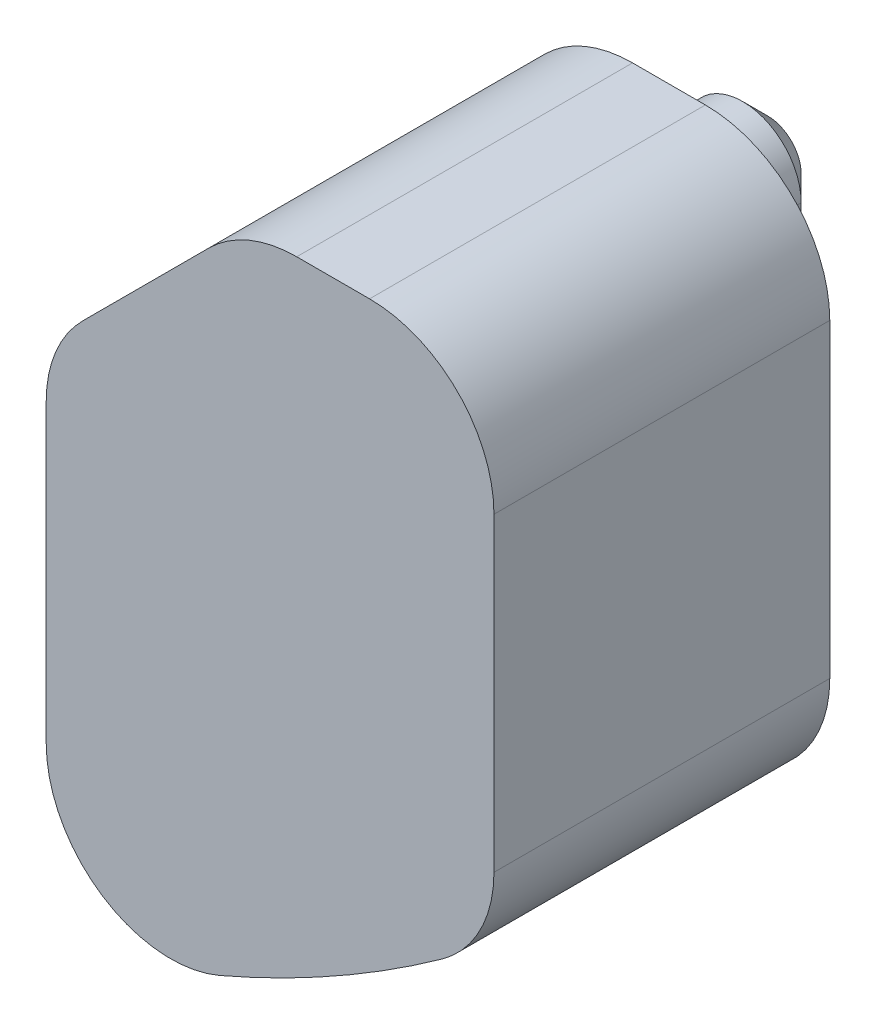
ISO-10303-21;
HEADER;
FILE_DESCRIPTION(('STEP AP214'),'2;1');
FILE_NAME('part.step','',(''),(''),'','','');
FILE_SCHEMA(('AUTOMOTIVE_DESIGN { 1 0 10303 214 1 1 1 1 }'));
ENDSEC;
DATA;
#1=APPLICATION_CONTEXT('core data for automotive mechanical design processes');
#2=APPLICATION_PROTOCOL_DEFINITION('international standard','automotive_design',2000,#1);
#3=PRODUCT_CONTEXT('',#1,'mechanical');
#4=PRODUCT('Part','Part','',(#3));
#5=PRODUCT_RELATED_PRODUCT_CATEGORY('part','',(#4));
#6=PRODUCT_DEFINITION_FORMATION('','',#4);
#7=PRODUCT_DEFINITION_CONTEXT('part definition',#1,'design');
#8=PRODUCT_DEFINITION('design','',#6,#7);
#9=PRODUCT_DEFINITION_SHAPE('','',#8);
#10=(LENGTH_UNIT() NAMED_UNIT(*) SI_UNIT(.MILLI.,.METRE.));
#11=(NAMED_UNIT(*) PLANE_ANGLE_UNIT() SI_UNIT($,.RADIAN.));
#12=(NAMED_UNIT(*) SI_UNIT($,.STERADIAN.) SOLID_ANGLE_UNIT());
#13=UNCERTAINTY_MEASURE_WITH_UNIT(LENGTH_MEASURE(1.E-05),#10,'distance_accuracy_value','');
#14=(GEOMETRIC_REPRESENTATION_CONTEXT(3) GLOBAL_UNCERTAINTY_ASSIGNED_CONTEXT((#13)) GLOBAL_UNIT_ASSIGNED_CONTEXT((#10,
#11,#12)) REPRESENTATION_CONTEXT('',''));
#15=CARTESIAN_POINT('',(0.,0.,0.));
#16=DIRECTION('',(0.,0.,1.));
#17=DIRECTION('',(1.,0.,0.));
#18=AXIS2_PLACEMENT_3D('',#15,#16,#17);
#19=CARTESIAN_POINT('',(0.,0.,0.));
#20=DIRECTION('',(0.,0.,-1.));
#21=DIRECTION('',(-1.,0.,0.));
#22=AXIS2_PLACEMENT_3D('',#19,#20,#21);
#23=PLANE('',#22);
#24=CARTESIAN_POINT('',(10.75,-19.,0.));
#25=DIRECTION('',(0.,0.,-1.));
#26=DIRECTION('',(1.,0.,0.));
#27=AXIS2_PLACEMENT_3D('',#24,#25,#26);
#28=CIRCLE('',#27,1.175);
#29=CARTESIAN_POINT('',(11.925,-19.,0.));
#30=VERTEX_POINT('',#29);
#31=CARTESIAN_POINT('',(9.575,-19.,0.));
#32=VERTEX_POINT('',#31);
#33=EDGE_CURVE('E177',#30,#32,#28,.T.);
#34=ORIENTED_EDGE('',*,*,#33,.F.);
#35=DIRECTION('',(0.,-1.,0.));
#36=VECTOR('',#35,1.);
#37=CARTESIAN_POINT('',(11.925,-19.,0.));
#38=LINE('',#37,#36);
#39=CARTESIAN_POINT('',(11.925,-12.,0.));
#40=VERTEX_POINT('',#39);
#41=EDGE_CURVE('E173',#40,#30,#38,.T.);
#42=ORIENTED_EDGE('',*,*,#41,.F.);
#43=CARTESIAN_POINT('',(10.75,-12.,0.));
#44=DIRECTION('',(0.,0.,-1.));
#45=DIRECTION('',(-1.,0.,0.));
#46=AXIS2_PLACEMENT_3D('',#43,#44,#45);
#47=CIRCLE('',#46,1.175);
#48=CARTESIAN_POINT('',(9.575,-12.,0.));
#49=VERTEX_POINT('',#48);
#50=EDGE_CURVE('E158',#49,#40,#47,.T.);
#51=ORIENTED_EDGE('',*,*,#50,.F.);
#52=DIRECTION('',(0.,1.,0.));
#53=VECTOR('',#52,1.);
#54=CARTESIAN_POINT('',(9.575,-19.,0.));
#55=LINE('',#54,#53);
#56=EDGE_CURVE('E170',#32,#49,#55,.T.);
#57=ORIENTED_EDGE('',*,*,#56,.F.);
#58=EDGE_LOOP('',(#34,#42,#51,#57));
#59=FACE_BOUND('',#58,.T.);
#60=DIRECTION('',(0.,-1.,0.));
#61=VECTOR('',#60,1.);
#62=CARTESIAN_POINT('',(6.,-23.2379000772445,0.));
#63=LINE('',#62,#61);
#64=CARTESIAN_POINT('',(6.,-13.7956956683594,0.));
#65=VERTEX_POINT('',#64);
#66=CARTESIAN_POINT('',(6.,-19.7484176581315,0.));
#67=VERTEX_POINT('',#66);
#68=EDGE_CURVE('E221',#65,#67,#63,.T.);
#69=ORIENTED_EDGE('',*,*,#68,.F.);
#70=CARTESIAN_POINT('',(8.5,-13.7956956683594,0.));
#71=DIRECTION('',(0.,0.,-1.));
#72=DIRECTION('',(-1.,0.,0.));
#73=AXIS2_PLACEMENT_3D('',#70,#71,#72);
#74=CIRCLE('',#73,2.5);
#75=CARTESIAN_POINT('',(6.73223304703363,-12.027928715393,0.));
#76=VERTEX_POINT('',#75);
#77=EDGE_CURVE('E238',#65,#76,#74,.T.);
#78=ORIENTED_EDGE('',*,*,#77,.T.);
#79=DIRECTION('',(-0.707106781186546,-0.707106781186549,0.));
#80=VECTOR('',#79,1.);
#81=CARTESIAN_POINT('',(6.,-12.7601617624266,0.));
#82=LINE('',#81,#80);
#83=CARTESIAN_POINT('',(9.26776695296637,-9.49239480946026,0.));
#84=VERTEX_POINT('',#83);
#85=EDGE_CURVE('E218',#84,#76,#82,.T.);
#86=ORIENTED_EDGE('',*,*,#85,.F.);
#87=CARTESIAN_POINT('',(11.0355339059327,-11.2601617624266,0.));
#88=DIRECTION('',(0.,0.,-1.));
#89=DIRECTION('',(-1.,0.,0.));
#90=AXIS2_PLACEMENT_3D('',#87,#88,#89);
#91=CIRCLE('',#90,2.5);
#92=CARTESIAN_POINT('',(11.0355339059327,-8.76016176242662,0.));
#93=VERTEX_POINT('',#92);
#94=EDGE_CURVE('E236',#84,#93,#91,.T.);
#95=ORIENTED_EDGE('',*,*,#94,.T.);
#96=DIRECTION('',(-1.,0.,0.));
#97=VECTOR('',#96,1.);
#98=CARTESIAN_POINT('',(10.,-8.76016176242662,0.));
#99=LINE('',#98,#97);
#100=CARTESIAN_POINT('',(12.5,-8.76016176242662,0.));
#101=VERTEX_POINT('',#100);
#102=EDGE_CURVE('E215',#101,#93,#99,.T.);
#103=ORIENTED_EDGE('',*,*,#102,.F.);
#104=CARTESIAN_POINT('',(12.5,-11.2601617624266,0.));
#105=DIRECTION('',(0.,0.,-1.));
#106=DIRECTION('',(-1.,0.,0.));
#107=AXIS2_PLACEMENT_3D('',#104,#105,#106);
#108=CIRCLE('',#107,2.5);
#109=CARTESIAN_POINT('',(15.,-11.2601617624266,0.));
#110=VERTEX_POINT('',#109);
#111=EDGE_CURVE('E234',#101,#110,#108,.T.);
#112=ORIENTED_EDGE('',*,*,#111,.T.);
#113=DIRECTION('',(0.,1.,0.));
#114=VECTOR('',#113,1.);
#115=CARTESIAN_POINT('',(15.,-8.76016176242662,0.));
#116=LINE('',#115,#114);
#117=CARTESIAN_POINT('',(15.,-17.4928556845359,0.));
#118=VERTEX_POINT('',#117);
#119=EDGE_CURVE('E212',#118,#110,#116,.T.);
#120=ORIENTED_EDGE('',*,*,#119,.F.);
#121=CARTESIAN_POINT('',(12.5,-17.4928556845359,0.));
#122=DIRECTION('',(0.,0.,-1.));
#123=DIRECTION('',(-1.,0.,0.));
#124=AXIS2_PLACEMENT_3D('',#121,#122,#123);
#125=CIRCLE('',#124,2.5);
#126=CARTESIAN_POINT('',(13.953488372093,-19.5269086711098,0.));
#127=VERTEX_POINT('',#126);
#128=EDGE_CURVE('E232',#118,#127,#125,.T.);
#129=ORIENTED_EDGE('',*,*,#128,.T.);
#130=CARTESIAN_POINT('',(0.,0.,0.));
#131=DIRECTION('',(0.,0.,1.));
#132=DIRECTION('',(-1.,0.,0.));
#133=AXIS2_PLACEMENT_3D('',#130,#131,#132);
#134=CIRCLE('',#133,24.);
#135=CARTESIAN_POINT('',(9.48837209302326,-22.044745292798,0.));
#136=VERTEX_POINT('',#135);
#137=EDGE_CURVE('E195',#136,#127,#134,.T.);
#138=ORIENTED_EDGE('',*,*,#137,.F.);
#139=CARTESIAN_POINT('',(8.5,-19.7484176581315,0.));
#140=DIRECTION('',(0.,0.,-1.));
#141=DIRECTION('',(-1.,0.,0.));
#142=AXIS2_PLACEMENT_3D('',#139,#140,#141);
#143=CIRCLE('',#142,2.5);
#144=EDGE_CURVE('E230',#136,#67,#143,.T.);
#145=ORIENTED_EDGE('',*,*,#144,.T.);
#146=EDGE_LOOP('',(#69,#78,#86,#95,#103,#112,#120,#129,#138,#145));
#147=FACE_BOUND('',#146,.T.);
#148=ADVANCED_FACE('F39',(#59,#147),#23,.T.);
#149=CARTESIAN_POINT('',(6.,-23.2379000772445,23.7971377865126));
#150=DIRECTION('',(1.,0.,0.));
#151=DIRECTION('',(0.,0.,-1.));
#152=AXIS2_PLACEMENT_3D('',#149,#150,#151);
#153=PLANE('',#152);
#154=CARTESIAN_POINT('',(6.,-17.0601617624266,4.));
#155=DIRECTION('',(-1.,0.,0.));
#156=DIRECTION('',(0.,0.,1.));
#157=AXIS2_PLACEMENT_3D('',#154,#155,#156);
#158=CIRCLE('',#157,2.421001);
#159=CARTESIAN_POINT('',(6.,-17.0601617624266,6.421001));
#160=VERTEX_POINT('',#159);
#161=EDGE_CURVE('E186',#160,#160,#158,.T.);
#162=ORIENTED_EDGE('',*,*,#161,.F.);
#163=EDGE_LOOP('',(#162));
#164=FACE_BOUND('',#163,.T.);
#165=DIRECTION('',(0.,1.,0.));
#166=VECTOR('',#165,1.);
#167=CARTESIAN_POINT('',(6.,-23.2379000772445,6.75));
#168=LINE('',#167,#166);
#169=CARTESIAN_POINT('',(6.,-19.7484176581315,6.75));
#170=VERTEX_POINT('',#169);
#171=CARTESIAN_POINT('',(6.,-13.7956956683594,6.75));
#172=VERTEX_POINT('',#171);
#173=EDGE_CURVE('E200',#170,#172,#168,.T.);
#174=ORIENTED_EDGE('',*,*,#173,.T.);
#175=DIRECTION('',(0.,0.,-1.));
#176=VECTOR('',#175,1.);
#177=CARTESIAN_POINT('',(6.,-13.7956956683594,23.7971377865126));
#178=LINE('',#177,#176);
#179=EDGE_CURVE('E227',#172,#65,#178,.T.);
#180=ORIENTED_EDGE('',*,*,#179,.T.);
#181=ORIENTED_EDGE('',*,*,#68,.T.);
#182=DIRECTION('',(0.,0.,-1.));
#183=VECTOR('',#182,1.);
#184=CARTESIAN_POINT('',(6.,-19.7484176581315,23.7971377865126));
#185=LINE('',#184,#183);
#186=EDGE_CURVE('E209',#67,#170,#185,.F.);
#187=ORIENTED_EDGE('',*,*,#186,.T.);
#188=EDGE_LOOP('',(#174,#180,#181,#187));
#189=FACE_BOUND('',#188,.T.);
#190=ADVANCED_FACE('F324',(#164,#189),#153,.F.);
#191=CARTESIAN_POINT('',(6.,-12.7601617624266,23.7971377865126));
#192=DIRECTION('',(0.707106781186549,-0.707106781186546,0.));
#193=DIRECTION('',(0.707106781186546,0.707106781186549,0.));
#194=AXIS2_PLACEMENT_3D('',#191,#192,#193);
#195=PLANE('',#194);
#196=ORIENTED_EDGE('',*,*,#85,.T.);
#197=DIRECTION('',(0.,0.,-1.));
#198=VECTOR('',#197,1.);
#199=CARTESIAN_POINT('',(6.73223304703363,-12.027928715393,23.7971377865126));
#200=LINE('',#199,#198);
#201=CARTESIAN_POINT('',(6.73223304703363,-12.027928715393,6.75));
#202=VERTEX_POINT('',#201);
#203=EDGE_CURVE('E243',#76,#202,#200,.F.);
#204=ORIENTED_EDGE('',*,*,#203,.T.);
#205=DIRECTION('',(0.707106781186546,0.707106781186549,0.));
#206=VECTOR('',#205,1.);
#207=CARTESIAN_POINT('',(6.,-12.7601617624266,6.75));
#208=LINE('',#207,#206);
#209=CARTESIAN_POINT('',(9.26776695296637,-9.49239480946026,6.75));
#210=VERTEX_POINT('',#209);
#211=EDGE_CURVE('E196',#202,#210,#208,.T.);
#212=ORIENTED_EDGE('',*,*,#211,.T.);
#213=DIRECTION('',(0.,0.,-1.));
#214=VECTOR('',#213,1.);
#215=CARTESIAN_POINT('',(9.26776695296637,-9.49239480946026,23.7971377865126));
#216=LINE('',#215,#214);
#217=EDGE_CURVE('E240',#210,#84,#216,.T.);
#218=ORIENTED_EDGE('',*,*,#217,.T.);
#219=EDGE_LOOP('',(#196,#204,#212,#218));
#220=FACE_BOUND('',#219,.T.);
#221=ADVANCED_FACE('F329',(#220),#195,.F.);
#222=CARTESIAN_POINT('',(10.,-8.76016176242662,23.7971377865126));
#223=DIRECTION('',(0.,-1.,0.));
#224=DIRECTION('',(0.,0.,-1.));
#225=AXIS2_PLACEMENT_3D('',#222,#223,#224);
#226=PLANE('',#225);
#227=ORIENTED_EDGE('',*,*,#102,.T.);
#228=DIRECTION('',(0.,0.,-1.));
#229=VECTOR('',#228,1.);
#230=CARTESIAN_POINT('',(11.0355339059327,-8.76016176242662,23.7971377865126));
#231=LINE('',#230,#229);
#232=CARTESIAN_POINT('',(11.0355339059327,-8.76016176242662,6.75));
#233=VERTEX_POINT('',#232);
#234=EDGE_CURVE('E258',#93,#233,#231,.F.);
#235=ORIENTED_EDGE('',*,*,#234,.T.);
#236=DIRECTION('',(1.,0.,0.));
#237=VECTOR('',#236,1.);
#238=CARTESIAN_POINT('',(10.,-8.76016176242662,6.75));
#239=LINE('',#238,#237);
#240=CARTESIAN_POINT('',(12.5,-8.76016176242662,6.75));
#241=VERTEX_POINT('',#240);
#242=EDGE_CURVE('E199',#233,#241,#239,.T.);
#243=ORIENTED_EDGE('',*,*,#242,.T.);
#244=DIRECTION('',(0.,0.,-1.));
#245=VECTOR('',#244,1.);
#246=CARTESIAN_POINT('',(12.5,-8.76016176242662,23.7971377865126));
#247=LINE('',#246,#245);
#248=EDGE_CURVE('E255',#241,#101,#247,.T.);
#249=ORIENTED_EDGE('',*,*,#248,.T.);
#250=EDGE_LOOP('',(#227,#235,#243,#249));
#251=FACE_BOUND('',#250,.T.);
#252=ADVANCED_FACE('F338',(#251),#226,.F.);
#253=CARTESIAN_POINT('',(15.,-8.76016176242662,23.7971377865126));
#254=DIRECTION('',(-1.,0.,0.));
#255=DIRECTION('',(0.,0.,1.));
#256=AXIS2_PLACEMENT_3D('',#253,#254,#255);
#257=PLANE('',#256);
#258=ORIENTED_EDGE('',*,*,#119,.T.);
#259=DIRECTION('',(0.,0.,-1.));
#260=VECTOR('',#259,1.);
#261=CARTESIAN_POINT('',(15.,-11.2601617624266,23.7971377865126));
#262=LINE('',#261,#260);
#263=CARTESIAN_POINT('',(15.,-11.2601617624266,6.75));
#264=VERTEX_POINT('',#263);
#265=EDGE_CURVE('E263',#110,#264,#262,.F.);
#266=ORIENTED_EDGE('',*,*,#265,.T.);
#267=DIRECTION('',(0.,-1.,0.));
#268=VECTOR('',#267,1.);
#269=CARTESIAN_POINT('',(15.,-8.76016176242662,6.75));
#270=LINE('',#269,#268);
#271=CARTESIAN_POINT('',(15.,-17.4928556845359,6.75));
#272=VERTEX_POINT('',#271);
#273=EDGE_CURVE('E203',#264,#272,#270,.T.);
#274=ORIENTED_EDGE('',*,*,#273,.T.);
#275=DIRECTION('',(0.,0.,-1.));
#276=VECTOR('',#275,1.);
#277=CARTESIAN_POINT('',(15.,-17.4928556845359,23.7971377865126));
#278=LINE('',#277,#276);
#279=EDGE_CURVE('E260',#272,#118,#278,.T.);
#280=ORIENTED_EDGE('',*,*,#279,.T.);
#281=EDGE_LOOP('',(#258,#266,#274,#280));
#282=FACE_BOUND('',#281,.T.);
#283=ADVANCED_FACE('F342',(#282),#257,.F.);
#284=CARTESIAN_POINT('',(0.,0.,23.7971377865126));
#285=DIRECTION('',(0.,0.,-1.));
#286=DIRECTION('',(-1.,0.,0.));
#287=AXIS2_PLACEMENT_3D('',#284,#285,#286);
#288=CYLINDRICAL_SURFACE('',#287,24.);
#289=ORIENTED_EDGE('',*,*,#137,.T.);
#290=DIRECTION('',(0.,0.,-1.));
#291=VECTOR('',#290,1.);
#292=CARTESIAN_POINT('',(13.953488372093,-19.5269086711099,23.7971377865126));
#293=LINE('',#292,#291);
#294=CARTESIAN_POINT('',(13.953488372093,-19.5269086711098,6.75));
#295=VERTEX_POINT('',#294);
#296=EDGE_CURVE('E268',#127,#295,#293,.F.);
#297=ORIENTED_EDGE('',*,*,#296,.T.);
#298=CARTESIAN_POINT('',(0.,0.,6.75));
#299=DIRECTION('',(0.,0.,-1.));
#300=DIRECTION('',(-1.,0.,0.));
#301=AXIS2_PLACEMENT_3D('',#298,#299,#300);
#302=CIRCLE('',#301,24.);
#303=CARTESIAN_POINT('',(9.48837209302326,-22.044745292798,6.75));
#304=VERTEX_POINT('',#303);
#305=EDGE_CURVE('E206',#295,#304,#302,.T.);
#306=ORIENTED_EDGE('',*,*,#305,.T.);
#307=DIRECTION('',(0.,0.,-1.));
#308=VECTOR('',#307,1.);
#309=CARTESIAN_POINT('',(9.48837209302326,-22.044745292798,23.7971377865126));
#310=LINE('',#309,#308);
#311=EDGE_CURVE('E265',#304,#136,#310,.T.);
#312=ORIENTED_EDGE('',*,*,#311,.T.);
#313=EDGE_LOOP('',(#289,#297,#306,#312));
#314=FACE_BOUND('',#313,.T.);
#315=ADVANCED_FACE('F346',(#314),#288,.T.);
#316=CARTESIAN_POINT('',(0.,0.,6.75));
#317=DIRECTION('',(0.,0.,-1.));
#318=DIRECTION('',(-1.,0.,0.));
#319=AXIS2_PLACEMENT_3D('',#316,#317,#318);
#320=PLANE('',#319);
#321=ORIENTED_EDGE('',*,*,#211,.F.);
#322=CARTESIAN_POINT('',(8.5,-13.7956956683594,6.75));
#323=DIRECTION('',(0.,0.,-1.));
#324=DIRECTION('',(-1.,0.,0.));
#325=AXIS2_PLACEMENT_3D('',#322,#323,#324);
#326=CIRCLE('',#325,2.5);
#327=EDGE_CURVE('E253',#202,#172,#326,.F.);
#328=ORIENTED_EDGE('',*,*,#327,.T.);
#329=ORIENTED_EDGE('',*,*,#173,.F.);
#330=CARTESIAN_POINT('',(8.5,-19.7484176581315,6.75));
#331=DIRECTION('',(0.,0.,-1.));
#332=DIRECTION('',(-1.,0.,0.));
#333=AXIS2_PLACEMENT_3D('',#330,#331,#332);
#334=CIRCLE('',#333,2.5);
#335=EDGE_CURVE('E245',#170,#304,#334,.F.);
#336=ORIENTED_EDGE('',*,*,#335,.T.);
#337=ORIENTED_EDGE('',*,*,#305,.F.);
#338=CARTESIAN_POINT('',(12.5,-17.4928556845359,6.75));
#339=DIRECTION('',(0.,0.,-1.));
#340=DIRECTION('',(-1.,0.,0.));
#341=AXIS2_PLACEMENT_3D('',#338,#339,#340);
#342=CIRCLE('',#341,2.5);
#343=EDGE_CURVE('E247',#295,#272,#342,.F.);
#344=ORIENTED_EDGE('',*,*,#343,.T.);
#345=ORIENTED_EDGE('',*,*,#273,.F.);
#346=CARTESIAN_POINT('',(12.5,-11.2601617624266,6.75));
#347=DIRECTION('',(0.,0.,-1.));
#348=DIRECTION('',(-1.,0.,0.));
#349=AXIS2_PLACEMENT_3D('',#346,#347,#348);
#350=CIRCLE('',#349,2.5);
#351=EDGE_CURVE('E249',#264,#241,#350,.F.);
#352=ORIENTED_EDGE('',*,*,#351,.T.);
#353=ORIENTED_EDGE('',*,*,#242,.F.);
#354=CARTESIAN_POINT('',(11.0355339059327,-11.2601617624266,6.75));
#355=DIRECTION('',(0.,0.,-1.));
#356=DIRECTION('',(-1.,0.,0.));
#357=AXIS2_PLACEMENT_3D('',#354,#355,#356);
#358=CIRCLE('',#357,2.5);
#359=EDGE_CURVE('E251',#233,#210,#358,.F.);
#360=ORIENTED_EDGE('',*,*,#359,.T.);
#361=EDGE_LOOP('',(#321,#328,#329,#336,#337,#344,#345,#352,#353,#360));
#362=FACE_BOUND('',#361,.T.);
#363=ADVANCED_FACE('F333',(#362),#320,.F.);
#364=CARTESIAN_POINT('',(8.5,-13.7956956683594,23.7971377865126));
#365=DIRECTION('',(0.,0.,-1.));
#366=DIRECTION('',(-1.,0.,0.));
#367=AXIS2_PLACEMENT_3D('',#364,#365,#366);
#368=CYLINDRICAL_SURFACE('',#367,2.5);
#369=ORIENTED_EDGE('',*,*,#327,.F.);
#370=ORIENTED_EDGE('',*,*,#203,.F.);
#371=ORIENTED_EDGE('',*,*,#77,.F.);
#372=ORIENTED_EDGE('',*,*,#179,.F.);
#373=EDGE_LOOP('',(#369,#370,#371,#372));
#374=FACE_BOUND('',#373,.T.);
#375=ADVANCED_FACE('F351',(#374),#368,.T.);
#376=CARTESIAN_POINT('',(11.0355339059327,-11.2601617624266,23.7971377865126));
#377=DIRECTION('',(0.,0.,-1.));
#378=DIRECTION('',(-1.,0.,0.));
#379=AXIS2_PLACEMENT_3D('',#376,#377,#378);
#380=CYLINDRICAL_SURFACE('',#379,2.5);
#381=ORIENTED_EDGE('',*,*,#359,.F.);
#382=ORIENTED_EDGE('',*,*,#234,.F.);
#383=ORIENTED_EDGE('',*,*,#94,.F.);
#384=ORIENTED_EDGE('',*,*,#217,.F.);
#385=EDGE_LOOP('',(#381,#382,#383,#384));
#386=FACE_BOUND('',#385,.T.);
#387=ADVANCED_FACE('F354',(#386),#380,.T.);
#388=CARTESIAN_POINT('',(12.5,-11.2601617624266,23.7971377865126));
#389=DIRECTION('',(0.,0.,-1.));
#390=DIRECTION('',(-1.,0.,0.));
#391=AXIS2_PLACEMENT_3D('',#388,#389,#390);
#392=CYLINDRICAL_SURFACE('',#391,2.5);
#393=ORIENTED_EDGE('',*,*,#351,.F.);
#394=ORIENTED_EDGE('',*,*,#265,.F.);
#395=ORIENTED_EDGE('',*,*,#111,.F.);
#396=ORIENTED_EDGE('',*,*,#248,.F.);
#397=EDGE_LOOP('',(#393,#394,#395,#396));
#398=FACE_BOUND('',#397,.T.);
#399=ADVANCED_FACE('F358',(#398),#392,.T.);
#400=CARTESIAN_POINT('',(12.5,-17.4928556845359,23.7971377865126));
#401=DIRECTION('',(0.,0.,-1.));
#402=DIRECTION('',(-1.,0.,0.));
#403=AXIS2_PLACEMENT_3D('',#400,#401,#402);
#404=CYLINDRICAL_SURFACE('',#403,2.5);
#405=ORIENTED_EDGE('',*,*,#343,.F.);
#406=ORIENTED_EDGE('',*,*,#296,.F.);
#407=ORIENTED_EDGE('',*,*,#128,.F.);
#408=ORIENTED_EDGE('',*,*,#279,.F.);
#409=EDGE_LOOP('',(#405,#406,#407,#408));
#410=FACE_BOUND('',#409,.T.);
#411=ADVANCED_FACE('F362',(#410),#404,.T.);
#412=CARTESIAN_POINT('',(8.5,-19.7484176581315,23.7971377865126));
#413=DIRECTION('',(0.,0.,-1.));
#414=DIRECTION('',(-1.,0.,0.));
#415=AXIS2_PLACEMENT_3D('',#412,#413,#414);
#416=CYLINDRICAL_SURFACE('',#415,2.5);
#417=ORIENTED_EDGE('',*,*,#335,.F.);
#418=ORIENTED_EDGE('',*,*,#186,.F.);
#419=ORIENTED_EDGE('',*,*,#144,.F.);
#420=ORIENTED_EDGE('',*,*,#311,.F.);
#421=EDGE_LOOP('',(#417,#418,#419,#420));
#422=FACE_BOUND('',#421,.T.);
#423=ADVANCED_FACE('F366',(#422),#416,.T.);
#424=CARTESIAN_POINT('',(13.,-17.0601617624266,4.));
#425=DIRECTION('',(-1.,0.,0.));
#426=DIRECTION('',(0.,0.,1.));
#427=AXIS2_PLACEMENT_3D('',#424,#425,#426);
#428=CONICAL_SURFACE('',#427,1.78600099999999,1.02974425867665);
#429=CARTESIAN_POINT('',(14.0731376664438,-17.0601617624266,4.));
#430=VERTEX_POINT('',#429);
#431=VERTEX_LOOP('',#430);
#432=FACE_BOUND('',#431,.T.);
#433=CARTESIAN_POINT('',(13.,-17.0601617624266,4.));
#434=DIRECTION('',(-1.,0.,0.));
#435=DIRECTION('',(0.,0.,1.));
#436=AXIS2_PLACEMENT_3D('',#433,#434,#435);
#437=CIRCLE('',#436,1.78600099999999);
#438=CARTESIAN_POINT('',(13.,-17.0601617624266,5.78600099999998));
#439=VERTEX_POINT('',#438);
#440=EDGE_CURVE('E192',#439,#439,#437,.T.);
#441=ORIENTED_EDGE('',*,*,#440,.T.);
#442=EDGE_LOOP('',(#441));
#443=FACE_BOUND('',#442,.T.);
#444=ADVANCED_FACE('F370',(#432,#443),#428,.F.);
#445=CARTESIAN_POINT('',(6.,-17.0601617624266,4.));
#446=DIRECTION('',(-1.,0.,0.));
#447=DIRECTION('',(0.,0.,1.));
#448=AXIS2_PLACEMENT_3D('',#445,#446,#447);
#449=CYLINDRICAL_SURFACE('',#448,1.78600099999999);
#450=ORIENTED_EDGE('',*,*,#440,.F.);
#451=EDGE_LOOP('',(#450));
#452=FACE_BOUND('',#451,.T.);
#453=CARTESIAN_POINT('',(7.53302561210692,-17.0601617624266,4.));
#454=DIRECTION('',(-1.,0.,0.));
#455=DIRECTION('',(0.,0.,1.));
#456=AXIS2_PLACEMENT_3D('',#453,#454,#455);
#457=CIRCLE('',#456,1.786001);
#458=CARTESIAN_POINT('',(7.53302561210692,-17.0601617624266,5.786001));
#459=VERTEX_POINT('',#458);
#460=EDGE_CURVE('E189',#459,#459,#457,.T.);
#461=ORIENTED_EDGE('',*,*,#460,.T.);
#462=EDGE_LOOP('',(#461));
#463=FACE_BOUND('',#462,.T.);
#464=ADVANCED_FACE('F319',(#452,#463),#449,.F.);
#465=CARTESIAN_POINT('',(6.,-17.0601617624266,4.));
#466=DIRECTION('',(-1.,0.,0.));
#467=DIRECTION('',(0.,0.,1.));
#468=AXIS2_PLACEMENT_3D('',#465,#466,#467);
#469=CONICAL_SURFACE('',#468,2.421001,0.392699081698723);
#470=ORIENTED_EDGE('',*,*,#460,.F.);
#471=EDGE_LOOP('',(#470));
#472=FACE_BOUND('',#471,.T.);
#473=ORIENTED_EDGE('',*,*,#161,.T.);
#474=EDGE_LOOP('',(#473));
#475=FACE_BOUND('',#474,.T.);
#476=ADVANCED_FACE('F312',(#472,#475),#469,.F.);
#477=CARTESIAN_POINT('',(11.925,-19.,-12.6407987220977));
#478=DIRECTION('',(-1.,0.,0.));
#479=DIRECTION('',(0.,0.,1.));
#480=AXIS2_PLACEMENT_3D('',#477,#478,#479);
#481=PLANE('',#480);
#482=DIRECTION('',(0.,0.,1.));
#483=VECTOR('',#482,1.);
#484=CARTESIAN_POINT('',(11.925,-19.,-12.6407987220977));
#485=LINE('',#484,#483);
#486=CARTESIAN_POINT('',(11.925,-19.,-2.5));
#487=VERTEX_POINT('',#486);
#488=EDGE_CURVE('E182',#487,#30,#485,.T.);
#489=ORIENTED_EDGE('',*,*,#488,.F.);
#490=DIRECTION('',(0.,1.,0.));
#491=VECTOR('',#490,1.);
#492=CARTESIAN_POINT('',(11.925,-19.,-2.5));
#493=LINE('',#492,#491);
#494=CARTESIAN_POINT('',(11.925,-12.,-2.5));
#495=VERTEX_POINT('',#494);
#496=EDGE_CURVE('E64',#487,#495,#493,.T.);
#497=ORIENTED_EDGE('',*,*,#496,.T.);
#498=DIRECTION('',(0.,0.,1.));
#499=VECTOR('',#498,1.);
#500=CARTESIAN_POINT('',(11.925,-12.,-12.6407987220977));
#501=LINE('',#500,#499);
#502=EDGE_CURVE('E163',#495,#40,#501,.T.);
#503=ORIENTED_EDGE('',*,*,#502,.T.);
#504=ORIENTED_EDGE('',*,*,#41,.T.);
#505=EDGE_LOOP('',(#489,#497,#503,#504));
#506=FACE_BOUND('',#505,.T.);
#507=ADVANCED_FACE('F310',(#506),#481,.F.);
#508=CARTESIAN_POINT('',(10.75,-12.,-12.6407987220977));
#509=DIRECTION('',(0.,0.,1.));
#510=DIRECTION('',(1.,0.,0.));
#511=AXIS2_PLACEMENT_3D('',#508,#509,#510);
#512=CYLINDRICAL_SURFACE('',#511,1.175);
#513=ORIENTED_EDGE('',*,*,#502,.F.);
#514=CARTESIAN_POINT('',(10.75,-12.,-2.5));
#515=DIRECTION('',(0.,0.,1.));
#516=DIRECTION('',(1.,0.,0.));
#517=AXIS2_PLACEMENT_3D('',#514,#515,#516);
#518=CIRCLE('',#517,1.175);
#519=CARTESIAN_POINT('',(9.575,-12.,-2.5));
#520=VERTEX_POINT('',#519);
#521=EDGE_CURVE('E49',#495,#520,#518,.T.);
#522=ORIENTED_EDGE('',*,*,#521,.T.);
#523=DIRECTION('',(0.,0.,1.));
#524=VECTOR('',#523,1.);
#525=CARTESIAN_POINT('',(9.575,-12.,-12.6407987220977));
#526=LINE('',#525,#524);
#527=EDGE_CURVE('E155',#520,#49,#526,.T.);
#528=ORIENTED_EDGE('',*,*,#527,.T.);
#529=ORIENTED_EDGE('',*,*,#50,.T.);
#530=EDGE_LOOP('',(#513,#522,#528,#529));
#531=FACE_BOUND('',#530,.T.);
#532=ADVANCED_FACE('F157',(#531),#512,.T.);
#533=CARTESIAN_POINT('',(9.575,-19.,-12.6407987220977));
#534=DIRECTION('',(1.,0.,0.));
#535=DIRECTION('',(0.,0.,-1.));
#536=AXIS2_PLACEMENT_3D('',#533,#534,#535);
#537=PLANE('',#536);
#538=ORIENTED_EDGE('',*,*,#527,.F.);
#539=DIRECTION('',(0.,-1.,0.));
#540=VECTOR('',#539,1.);
#541=CARTESIAN_POINT('',(9.575,-19.,-2.5));
#542=LINE('',#541,#540);
#543=CARTESIAN_POINT('',(9.575,-19.,-2.5));
#544=VERTEX_POINT('',#543);
#545=EDGE_CURVE('E11',#520,#544,#542,.T.);
#546=ORIENTED_EDGE('',*,*,#545,.T.);
#547=DIRECTION('',(0.,0.,1.));
#548=VECTOR('',#547,1.);
#549=CARTESIAN_POINT('',(9.575,-19.,-12.6407987220977));
#550=LINE('',#549,#548);
#551=EDGE_CURVE('E162',#544,#32,#550,.T.);
#552=ORIENTED_EDGE('',*,*,#551,.T.);
#553=ORIENTED_EDGE('',*,*,#56,.T.);
#554=EDGE_LOOP('',(#538,#546,#552,#553));
#555=FACE_BOUND('',#554,.T.);
#556=ADVANCED_FACE('F175',(#555),#537,.F.);
#557=CARTESIAN_POINT('',(10.75,-19.,-12.6407987220977));
#558=DIRECTION('',(0.,0.,1.));
#559=DIRECTION('',(1.,0.,0.));
#560=AXIS2_PLACEMENT_3D('',#557,#558,#559);
#561=CYLINDRICAL_SURFACE('',#560,1.175);
#562=ORIENTED_EDGE('',*,*,#551,.F.);
#563=CARTESIAN_POINT('',(10.75,-19.,-2.5));
#564=DIRECTION('',(0.,0.,1.));
#565=DIRECTION('',(1.,0.,0.));
#566=AXIS2_PLACEMENT_3D('',#563,#564,#565);
#567=CIRCLE('',#566,1.175);
#568=EDGE_CURVE('E270',#544,#487,#567,.T.);
#569=ORIENTED_EDGE('',*,*,#568,.T.);
#570=ORIENTED_EDGE('',*,*,#488,.T.);
#571=ORIENTED_EDGE('',*,*,#33,.T.);
#572=EDGE_LOOP('',(#562,#569,#570,#571));
#573=FACE_BOUND('',#572,.T.);
#574=ADVANCED_FACE('F309',(#573),#561,.T.);
#575=CARTESIAN_POINT('',(0.,0.,-3.));
#576=DIRECTION('',(0.,0.,1.));
#577=DIRECTION('',(1.,0.,0.));
#578=AXIS2_PLACEMENT_3D('',#575,#576,#577);
#579=PLANE('',#578);
#580=DIRECTION('',(0.,-1.,0.));
#581=VECTOR('',#580,1.);
#582=CARTESIAN_POINT('',(11.425,0.,-3.));
#583=LINE('',#582,#581);
#584=CARTESIAN_POINT('',(11.425,-12.,-3.));
#585=VERTEX_POINT('',#584);
#586=CARTESIAN_POINT('',(11.425,-19.,-3.));
#587=VERTEX_POINT('',#586);
#588=EDGE_CURVE('E277',#585,#587,#583,.T.);
#589=ORIENTED_EDGE('',*,*,#588,.T.);
#590=CARTESIAN_POINT('',(10.75,-19.,-3.));
#591=DIRECTION('',(0.,0.,1.));
#592=DIRECTION('',(1.,0.,0.));
#593=AXIS2_PLACEMENT_3D('',#590,#591,#592);
#594=CIRCLE('',#593,0.674999999999997);
#595=CARTESIAN_POINT('',(10.075,-19.,-3.));
#596=VERTEX_POINT('',#595);
#597=EDGE_CURVE('E279',#587,#596,#594,.F.);
#598=ORIENTED_EDGE('',*,*,#597,.T.);
#599=DIRECTION('',(0.,1.,0.));
#600=VECTOR('',#599,1.);
#601=CARTESIAN_POINT('',(10.075,0.,-3.));
#602=LINE('',#601,#600);
#603=CARTESIAN_POINT('',(10.075,-12.,-3.));
#604=VERTEX_POINT('',#603);
#605=EDGE_CURVE('E273',#596,#604,#602,.T.);
#606=ORIENTED_EDGE('',*,*,#605,.T.);
#607=CARTESIAN_POINT('',(10.75,-12.,-3.));
#608=DIRECTION('',(0.,0.,1.));
#609=DIRECTION('',(1.,0.,0.));
#610=AXIS2_PLACEMENT_3D('',#607,#608,#609);
#611=CIRCLE('',#610,0.674999999999997);
#612=EDGE_CURVE('E275',#604,#585,#611,.F.);
#613=ORIENTED_EDGE('',*,*,#612,.T.);
#614=EDGE_LOOP('',(#589,#598,#606,#613));
#615=FACE_BOUND('',#614,.T.);
#616=ADVANCED_FACE('F301',(#615),#579,.F.);
#617=CARTESIAN_POINT('',(10.75,-12.,-2.5));
#618=DIRECTION('',(0.,0.,1.));
#619=DIRECTION('',(1.,0.,0.));
#620=AXIS2_PLACEMENT_3D('',#617,#618,#619);
#621=CONICAL_SURFACE('',#620,1.175,0.78539816339745);
#622=DIRECTION('',(0.707106781186548,0.,0.707106781186547));
#623=VECTOR('',#622,1.);
#624=CARTESIAN_POINT('',(11.425,-12.,-3.));
#625=LINE('',#624,#623);
#626=EDGE_CURVE('E287',#585,#495,#625,.T.);
#627=ORIENTED_EDGE('',*,*,#626,.F.);
#628=ORIENTED_EDGE('',*,*,#612,.F.);
#629=DIRECTION('',(0.707106781186548,0.,-0.707106781186547));
#630=VECTOR('',#629,1.);
#631=CARTESIAN_POINT('',(9.575,-12.,-2.5));
#632=LINE('',#631,#630);
#633=EDGE_CURVE('E44',#520,#604,#632,.T.);
#634=ORIENTED_EDGE('',*,*,#633,.F.);
#635=ORIENTED_EDGE('',*,*,#521,.F.);
#636=EDGE_LOOP('',(#627,#628,#634,#635));
#637=FACE_BOUND('',#636,.T.);
#638=ADVANCED_FACE('F42',(#637),#621,.T.);
#639=CARTESIAN_POINT('',(9.575,-19.,-2.5));
#640=DIRECTION('',(0.707106781186547,0.,0.707106781186548));
#641=DIRECTION('',(0.,-1.,0.));
#642=AXIS2_PLACEMENT_3D('',#639,#640,#641);
#643=PLANE('',#642);
#644=ORIENTED_EDGE('',*,*,#633,.T.);
#645=ORIENTED_EDGE('',*,*,#605,.F.);
#646=DIRECTION('',(0.707106781186548,0.,-0.707106781186547));
#647=VECTOR('',#646,1.);
#648=CARTESIAN_POINT('',(9.575,-19.,-2.5));
#649=LINE('',#648,#647);
#650=EDGE_CURVE('E286',#544,#596,#649,.T.);
#651=ORIENTED_EDGE('',*,*,#650,.F.);
#652=ORIENTED_EDGE('',*,*,#545,.F.);
#653=EDGE_LOOP('',(#644,#645,#651,#652));
#654=FACE_BOUND('',#653,.T.);
#655=ADVANCED_FACE('F296',(#654),#643,.F.);
#656=CARTESIAN_POINT('',(11.925,-19.,-2.5));
#657=DIRECTION('',(-0.707106781186547,0.,0.707106781186548));
#658=DIRECTION('',(0.,1.,0.));
#659=AXIS2_PLACEMENT_3D('',#656,#657,#658);
#660=PLANE('',#659);
#661=ORIENTED_EDGE('',*,*,#626,.T.);
#662=ORIENTED_EDGE('',*,*,#496,.F.);
#663=DIRECTION('',(0.707106781186548,0.,0.707106781186547));
#664=VECTOR('',#663,1.);
#665=CARTESIAN_POINT('',(11.425,-19.,-3.));
#666=LINE('',#665,#664);
#667=EDGE_CURVE('E284',#587,#487,#666,.T.);
#668=ORIENTED_EDGE('',*,*,#667,.F.);
#669=ORIENTED_EDGE('',*,*,#588,.F.);
#670=EDGE_LOOP('',(#661,#662,#668,#669));
#671=FACE_BOUND('',#670,.T.);
#672=ADVANCED_FACE('F307',(#671),#660,.F.);
#673=CARTESIAN_POINT('',(10.75,-19.,-2.5));
#674=DIRECTION('',(0.,0.,1.));
#675=DIRECTION('',(1.,0.,0.));
#676=AXIS2_PLACEMENT_3D('',#673,#674,#675);
#677=CONICAL_SURFACE('',#676,1.175,0.78539816339745);
#678=ORIENTED_EDGE('',*,*,#650,.T.);
#679=ORIENTED_EDGE('',*,*,#597,.F.);
#680=ORIENTED_EDGE('',*,*,#667,.T.);
#681=ORIENTED_EDGE('',*,*,#568,.F.);
#682=EDGE_LOOP('',(#678,#679,#680,#681));
#683=FACE_BOUND('',#682,.T.);
#684=ADVANCED_FACE('F305',(#683),#677,.T.);
#685=CLOSED_SHELL('',(#148,#190,#221,#252,#283,#315,#363,#375,#387,#399,#411,#423,#444,#464,
#476,#507,#532,#556,#574,#616,#638,#655,#672,#684));
#686=MANIFOLD_SOLID_BREP('B2',#685);
#687=ADVANCED_BREP_SHAPE_REPRESENTATION('',(#18,#686),#14);
#688=SHAPE_DEFINITION_REPRESENTATION(#9,#687);
ENDSEC;
END-ISO-10303-21;
